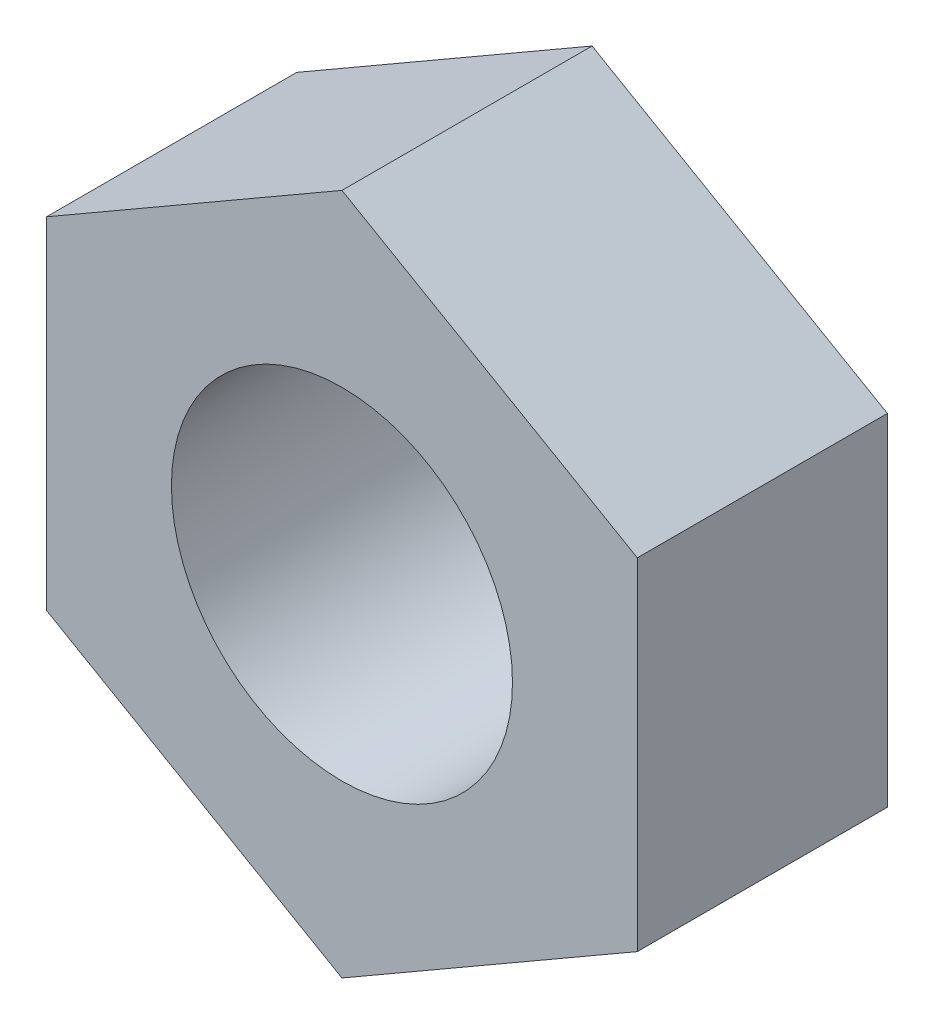
ISO-10303-21;
HEADER;
FILE_DESCRIPTION(('STEP AP214'),'2;1');
FILE_NAME('part.step','',(''),(''),'','','');
FILE_SCHEMA(('AUTOMOTIVE_DESIGN { 1 0 10303 214 1 1 1 1 }'));
ENDSEC;
DATA;
#1=APPLICATION_CONTEXT('core data for automotive mechanical design processes');
#2=APPLICATION_PROTOCOL_DEFINITION('international standard','automotive_design',2000,#1);
#3=PRODUCT_CONTEXT('',#1,'mechanical');
#4=PRODUCT('Part','Part','',(#3));
#5=PRODUCT_RELATED_PRODUCT_CATEGORY('part','',(#4));
#6=PRODUCT_DEFINITION_FORMATION('','',#4);
#7=PRODUCT_DEFINITION_CONTEXT('part definition',#1,'design');
#8=PRODUCT_DEFINITION('design','',#6,#7);
#9=PRODUCT_DEFINITION_SHAPE('','',#8);
#10=(LENGTH_UNIT() NAMED_UNIT(*) SI_UNIT(.MILLI.,.METRE.));
#11=(NAMED_UNIT(*) PLANE_ANGLE_UNIT() SI_UNIT($,.RADIAN.));
#12=(NAMED_UNIT(*) SI_UNIT($,.STERADIAN.) SOLID_ANGLE_UNIT());
#13=UNCERTAINTY_MEASURE_WITH_UNIT(LENGTH_MEASURE(1.E-05),#10,'distance_accuracy_value','');
#14=(GEOMETRIC_REPRESENTATION_CONTEXT(3) GLOBAL_UNCERTAINTY_ASSIGNED_CONTEXT((#13)) GLOBAL_UNIT_ASSIGNED_CONTEXT((#10,
#11,#12)) REPRESENTATION_CONTEXT('',''));
#15=CARTESIAN_POINT('',(0.,0.,0.));
#16=DIRECTION('',(0.,0.,1.));
#17=DIRECTION('',(1.,0.,0.));
#18=AXIS2_PLACEMENT_3D('',#15,#16,#17);
#19=CARTESIAN_POINT('',(0.,0.,2.2));
#20=DIRECTION('',(0.,0.,1.));
#21=DIRECTION('',(1.,0.,0.));
#22=AXIS2_PLACEMENT_3D('',#19,#20,#21);
#23=PLANE('',#22);
#24=DIRECTION('',(-0.866025403784442,0.499999999999995,0.));
#25=VECTOR('',#24,1.);
#26=CARTESIAN_POINT('',(2.5980762113533,1.50000000000003,2.2));
#27=LINE('',#26,#25);
#28=CARTESIAN_POINT('',(2.5980762113533,1.50000000000003,2.2));
#29=VERTEX_POINT('',#28);
#30=CARTESIAN_POINT('',(0.,3.,2.2));
#31=VERTEX_POINT('',#30);
#32=EDGE_CURVE('E128',#29,#31,#27,.T.);
#33=ORIENTED_EDGE('',*,*,#32,.T.);
#34=DIRECTION('',(-0.866025403784438,-0.500000000000001,0.));
#35=VECTOR('',#34,1.);
#36=CARTESIAN_POINT('',(0.,3.,2.2));
#37=LINE('',#36,#35);
#38=CARTESIAN_POINT('',(-2.59807621135332,1.49999999999999,2.2));
#39=VERTEX_POINT('',#38);
#40=EDGE_CURVE('E86',#31,#39,#37,.T.);
#41=ORIENTED_EDGE('',*,*,#40,.T.);
#42=DIRECTION('',(0.,-1.,0.));
#43=VECTOR('',#42,1.);
#44=CARTESIAN_POINT('',(-2.59807621135332,1.49999999999999,2.2));
#45=LINE('',#44,#43);
#46=CARTESIAN_POINT('',(-2.59807621135331,-1.50000000000001,2.2));
#47=VERTEX_POINT('',#46);
#48=EDGE_CURVE('E99',#39,#47,#45,.T.);
#49=ORIENTED_EDGE('',*,*,#48,.T.);
#50=DIRECTION('',(0.866025403784441,-0.499999999999995,0.));
#51=VECTOR('',#50,1.);
#52=CARTESIAN_POINT('',(-2.59807621135331,-1.50000000000001,2.2));
#53=LINE('',#52,#51);
#54=CARTESIAN_POINT('',(0.,-3.,2.2));
#55=VERTEX_POINT('',#54);
#56=EDGE_CURVE('E93',#47,#55,#53,.T.);
#57=ORIENTED_EDGE('',*,*,#56,.T.);
#58=DIRECTION('',(0.866025403784434,0.500000000000007,0.));
#59=VECTOR('',#58,1.);
#60=CARTESIAN_POINT('',(0.,-3.,2.2));
#61=LINE('',#60,#59);
#62=CARTESIAN_POINT('',(2.59807621135333,-1.49999999999998,2.2));
#63=VERTEX_POINT('',#62);
#64=EDGE_CURVE('E97',#55,#63,#61,.T.);
#65=ORIENTED_EDGE('',*,*,#64,.T.);
#66=DIRECTION('',(0.,1.,0.));
#67=VECTOR('',#66,1.);
#68=CARTESIAN_POINT('',(2.59807621135333,-1.49999999999998,2.2));
#69=LINE('',#68,#67);
#70=EDGE_CURVE('E49',#63,#29,#69,.T.);
#71=ORIENTED_EDGE('',*,*,#70,.T.);
#72=EDGE_LOOP('',(#33,#41,#49,#57,#65,#71));
#73=FACE_BOUND('',#72,.T.);
#74=CARTESIAN_POINT('',(0.,0.,2.2));
#75=DIRECTION('',(0.,0.,1.));
#76=DIRECTION('',(1.,0.,0.));
#77=AXIS2_PLACEMENT_3D('',#74,#75,#76);
#78=CIRCLE('',#77,1.5);
#79=CARTESIAN_POINT('',(1.5,0.,2.2));
#80=VERTEX_POINT('',#79);
#81=EDGE_CURVE('E121',#80,#80,#78,.T.);
#82=ORIENTED_EDGE('',*,*,#81,.F.);
#83=EDGE_LOOP('',(#82));
#84=FACE_BOUND('',#83,.T.);
#85=ADVANCED_FACE('F32',(#73,#84),#23,.T.);
#86=CARTESIAN_POINT('',(0.,0.,0.));
#87=DIRECTION('',(0.,0.,1.));
#88=DIRECTION('',(1.,0.,0.));
#89=AXIS2_PLACEMENT_3D('',#86,#87,#88);
#90=PLANE('',#89);
#91=DIRECTION('',(-0.866025403784442,0.499999999999995,0.));
#92=VECTOR('',#91,1.);
#93=CARTESIAN_POINT('',(2.5980762113533,1.50000000000003,0.));
#94=LINE('',#93,#92);
#95=CARTESIAN_POINT('',(2.5980762113533,1.50000000000003,0.));
#96=VERTEX_POINT('',#95);
#97=CARTESIAN_POINT('',(0.,3.,0.));
#98=VERTEX_POINT('',#97);
#99=EDGE_CURVE('E117',#96,#98,#94,.T.);
#100=ORIENTED_EDGE('',*,*,#99,.F.);
#101=DIRECTION('',(0.,1.,0.));
#102=VECTOR('',#101,1.);
#103=CARTESIAN_POINT('',(2.59807621135333,-1.49999999999998,0.));
#104=LINE('',#103,#102);
#105=CARTESIAN_POINT('',(2.59807621135333,-1.49999999999998,0.));
#106=VERTEX_POINT('',#105);
#107=EDGE_CURVE('E78',#106,#96,#104,.T.);
#108=ORIENTED_EDGE('',*,*,#107,.F.);
#109=DIRECTION('',(0.866025403784434,0.500000000000007,0.));
#110=VECTOR('',#109,1.);
#111=CARTESIAN_POINT('',(0.,-3.,0.));
#112=LINE('',#111,#110);
#113=CARTESIAN_POINT('',(0.,-3.,0.));
#114=VERTEX_POINT('',#113);
#115=EDGE_CURVE('E72',#114,#106,#112,.T.);
#116=ORIENTED_EDGE('',*,*,#115,.F.);
#117=DIRECTION('',(0.866025403784441,-0.499999999999995,0.));
#118=VECTOR('',#117,1.);
#119=CARTESIAN_POINT('',(-2.59807621135331,-1.50000000000001,0.));
#120=LINE('',#119,#118);
#121=CARTESIAN_POINT('',(-2.59807621135331,-1.50000000000001,0.));
#122=VERTEX_POINT('',#121);
#123=EDGE_CURVE('E107',#122,#114,#120,.T.);
#124=ORIENTED_EDGE('',*,*,#123,.F.);
#125=DIRECTION('',(0.,-1.,0.));
#126=VECTOR('',#125,1.);
#127=CARTESIAN_POINT('',(-2.59807621135332,1.49999999999999,0.));
#128=LINE('',#127,#126);
#129=CARTESIAN_POINT('',(-2.59807621135332,1.49999999999999,0.));
#130=VERTEX_POINT('',#129);
#131=EDGE_CURVE('E123',#130,#122,#128,.T.);
#132=ORIENTED_EDGE('',*,*,#131,.F.);
#133=DIRECTION('',(-0.866025403784438,-0.500000000000001,0.));
#134=VECTOR('',#133,1.);
#135=CARTESIAN_POINT('',(0.,3.,0.));
#136=LINE('',#135,#134);
#137=EDGE_CURVE('E120',#98,#130,#136,.T.);
#138=ORIENTED_EDGE('',*,*,#137,.F.);
#139=EDGE_LOOP('',(#100,#108,#116,#124,#132,#138));
#140=FACE_BOUND('',#139,.T.);
#141=CARTESIAN_POINT('',(0.,0.,0.));
#142=DIRECTION('',(0.,0.,1.));
#143=DIRECTION('',(1.,0.,0.));
#144=AXIS2_PLACEMENT_3D('',#141,#142,#143);
#145=CIRCLE('',#144,1.5);
#146=CARTESIAN_POINT('',(1.5,0.,0.));
#147=VERTEX_POINT('',#146);
#148=EDGE_CURVE('E221',#147,#147,#145,.T.);
#149=ORIENTED_EDGE('',*,*,#148,.T.);
#150=EDGE_LOOP('',(#149));
#151=FACE_BOUND('',#150,.T.);
#152=ADVANCED_FACE('F137',(#140,#151),#90,.F.);
#153=CARTESIAN_POINT('',(2.5980762113533,1.50000000000003,2.2));
#154=DIRECTION('',(-0.499999999999995,-0.866025403784442,0.));
#155=DIRECTION('',(0.866025403784442,-0.499999999999995,0.));
#156=AXIS2_PLACEMENT_3D('',#153,#154,#155);
#157=PLANE('',#156);
#158=ORIENTED_EDGE('',*,*,#99,.T.);
#159=DIRECTION('',(0.,0.,-1.));
#160=VECTOR('',#159,1.);
#161=CARTESIAN_POINT('',(0.,3.,2.2));
#162=LINE('',#161,#160);
#163=EDGE_CURVE('E11',#31,#98,#162,.T.);
#164=ORIENTED_EDGE('',*,*,#163,.F.);
#165=ORIENTED_EDGE('',*,*,#32,.F.);
#166=DIRECTION('',(0.,0.,-1.));
#167=VECTOR('',#166,1.);
#168=CARTESIAN_POINT('',(2.5980762113533,1.50000000000003,2.2));
#169=LINE('',#168,#167);
#170=EDGE_CURVE('E113',#29,#96,#169,.T.);
#171=ORIENTED_EDGE('',*,*,#170,.T.);
#172=EDGE_LOOP('',(#158,#164,#165,#171));
#173=FACE_BOUND('',#172,.T.);
#174=ADVANCED_FACE('F34',(#173),#157,.F.);
#175=CARTESIAN_POINT('',(0.,3.,2.2));
#176=DIRECTION('',(0.500000000000001,-0.866025403784438,0.));
#177=DIRECTION('',(0.866025403784438,0.500000000000001,0.));
#178=AXIS2_PLACEMENT_3D('',#175,#176,#177);
#179=PLANE('',#178);
#180=ORIENTED_EDGE('',*,*,#137,.T.);
#181=DIRECTION('',(0.,0.,-1.));
#182=VECTOR('',#181,1.);
#183=CARTESIAN_POINT('',(-2.59807621135332,1.49999999999999,2.2));
#184=LINE('',#183,#182);
#185=EDGE_CURVE('E41',#39,#130,#184,.T.);
#186=ORIENTED_EDGE('',*,*,#185,.F.);
#187=ORIENTED_EDGE('',*,*,#40,.F.);
#188=ORIENTED_EDGE('',*,*,#163,.T.);
#189=EDGE_LOOP('',(#180,#186,#187,#188));
#190=FACE_BOUND('',#189,.T.);
#191=ADVANCED_FACE('F162',(#190),#179,.F.);
#192=CARTESIAN_POINT('',(-2.59807621135332,1.49999999999999,2.2));
#193=DIRECTION('',(1.,0.,0.));
#194=DIRECTION('',(0.,1.,0.));
#195=AXIS2_PLACEMENT_3D('',#192,#193,#194);
#196=PLANE('',#195);
#197=ORIENTED_EDGE('',*,*,#131,.T.);
#198=DIRECTION('',(0.,0.,-1.));
#199=VECTOR('',#198,1.);
#200=CARTESIAN_POINT('',(-2.59807621135331,-1.50000000000001,2.2));
#201=LINE('',#200,#199);
#202=EDGE_CURVE('E108',#47,#122,#201,.T.);
#203=ORIENTED_EDGE('',*,*,#202,.F.);
#204=ORIENTED_EDGE('',*,*,#48,.F.);
#205=ORIENTED_EDGE('',*,*,#185,.T.);
#206=EDGE_LOOP('',(#197,#203,#204,#205));
#207=FACE_BOUND('',#206,.T.);
#208=ADVANCED_FACE('F134',(#207),#196,.F.);
#209=CARTESIAN_POINT('',(-2.59807621135331,-1.50000000000001,2.2));
#210=DIRECTION('',(0.499999999999995,0.866025403784441,0.));
#211=DIRECTION('',(-0.866025403784442,0.499999999999995,0.));
#212=AXIS2_PLACEMENT_3D('',#209,#210,#211);
#213=PLANE('',#212);
#214=ORIENTED_EDGE('',*,*,#123,.T.);
#215=DIRECTION('',(0.,0.,-1.));
#216=VECTOR('',#215,1.);
#217=CARTESIAN_POINT('',(0.,-3.,2.2));
#218=LINE('',#217,#216);
#219=EDGE_CURVE('E104',#55,#114,#218,.T.);
#220=ORIENTED_EDGE('',*,*,#219,.F.);
#221=ORIENTED_EDGE('',*,*,#56,.F.);
#222=ORIENTED_EDGE('',*,*,#202,.T.);
#223=EDGE_LOOP('',(#214,#220,#221,#222));
#224=FACE_BOUND('',#223,.T.);
#225=ADVANCED_FACE('F105',(#224),#213,.F.);
#226=CARTESIAN_POINT('',(0.,-3.,2.2));
#227=DIRECTION('',(-0.500000000000007,0.866025403784435,0.));
#228=DIRECTION('',(-0.866025403784434,-0.500000000000007,0.));
#229=AXIS2_PLACEMENT_3D('',#226,#227,#228);
#230=PLANE('',#229);
#231=ORIENTED_EDGE('',*,*,#115,.T.);
#232=DIRECTION('',(0.,0.,-1.));
#233=VECTOR('',#232,1.);
#234=CARTESIAN_POINT('',(2.59807621135333,-1.49999999999998,2.2));
#235=LINE('',#234,#233);
#236=EDGE_CURVE('E109',#63,#106,#235,.T.);
#237=ORIENTED_EDGE('',*,*,#236,.F.);
#238=ORIENTED_EDGE('',*,*,#64,.F.);
#239=ORIENTED_EDGE('',*,*,#219,.T.);
#240=EDGE_LOOP('',(#231,#237,#238,#239));
#241=FACE_BOUND('',#240,.T.);
#242=ADVANCED_FACE('F111',(#241),#230,.F.);
#243=CARTESIAN_POINT('',(2.59807621135333,-1.49999999999998,2.2));
#244=DIRECTION('',(-1.,0.,0.));
#245=DIRECTION('',(0.,-1.,0.));
#246=AXIS2_PLACEMENT_3D('',#243,#244,#245);
#247=PLANE('',#246);
#248=ORIENTED_EDGE('',*,*,#107,.T.);
#249=ORIENTED_EDGE('',*,*,#170,.F.);
#250=ORIENTED_EDGE('',*,*,#70,.F.);
#251=ORIENTED_EDGE('',*,*,#236,.T.);
#252=EDGE_LOOP('',(#248,#249,#250,#251));
#253=FACE_BOUND('',#252,.T.);
#254=ADVANCED_FACE('F142',(#253),#247,.F.);
#255=CARTESIAN_POINT('',(0.,0.,2.2));
#256=DIRECTION('',(0.,0.,-1.));
#257=DIRECTION('',(-1.,0.,0.));
#258=AXIS2_PLACEMENT_3D('',#255,#256,#257);
#259=CYLINDRICAL_SURFACE('',#258,1.5);
#260=ORIENTED_EDGE('',*,*,#81,.T.);
#261=EDGE_LOOP('',(#260));
#262=FACE_BOUND('',#261,.T.);
#263=ORIENTED_EDGE('',*,*,#148,.F.);
#264=EDGE_LOOP('',(#263));
#265=FACE_BOUND('',#264,.T.);
#266=ADVANCED_FACE('F144',(#262,#265),#259,.F.);
#267=CLOSED_SHELL('',(#85,#152,#174,#191,#208,#225,#242,#254,#266));
#268=MANIFOLD_SOLID_BREP('B2',#267);
#269=ADVANCED_BREP_SHAPE_REPRESENTATION('',(#18,#268),#14);
#270=SHAPE_DEFINITION_REPRESENTATION(#9,#269);
ENDSEC;
END-ISO-10303-21;
